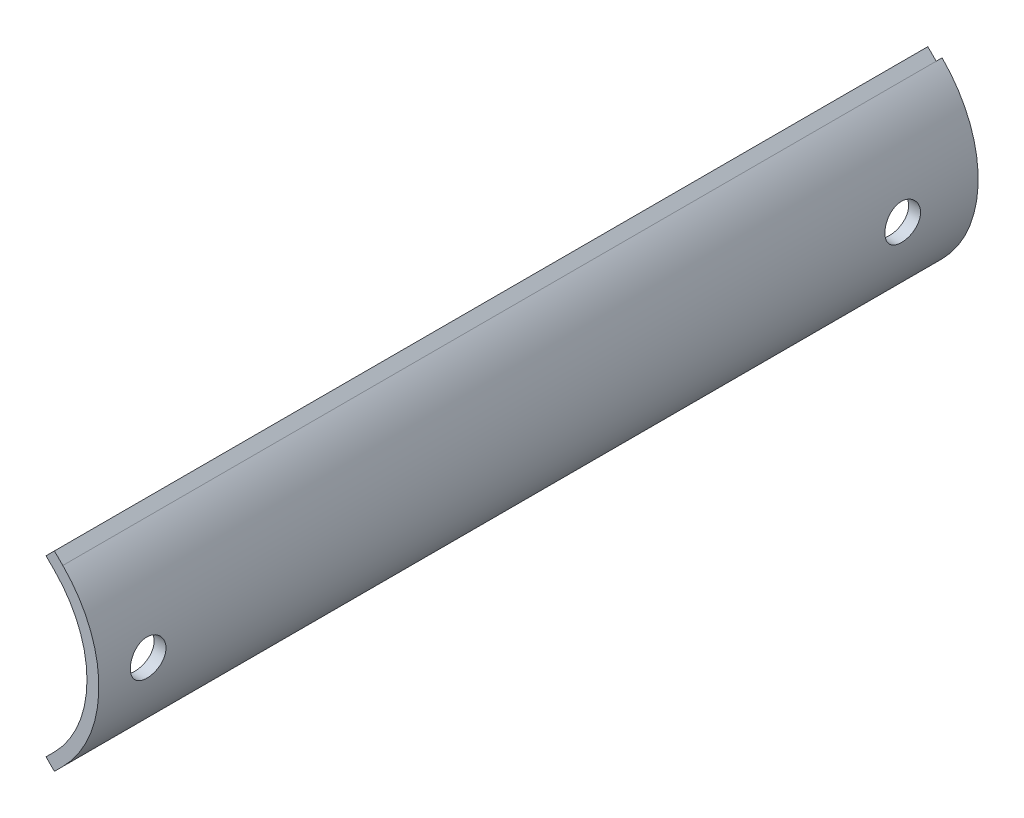
ISO-10303-21;
HEADER;
FILE_DESCRIPTION(('STEP AP214'),'2;1');
FILE_NAME('part.step','',(''),(''),'','','');
FILE_SCHEMA(('AUTOMOTIVE_DESIGN { 1 0 10303 214 1 1 1 1 }'));
ENDSEC;
DATA;
#1=APPLICATION_CONTEXT('core data for automotive mechanical design processes');
#2=APPLICATION_PROTOCOL_DEFINITION('international standard','automotive_design',2000,#1);
#3=PRODUCT_CONTEXT('',#1,'mechanical');
#4=PRODUCT('Part','Part','',(#3));
#5=PRODUCT_RELATED_PRODUCT_CATEGORY('part','',(#4));
#6=PRODUCT_DEFINITION_FORMATION('','',#4);
#7=PRODUCT_DEFINITION_CONTEXT('part definition',#1,'design');
#8=PRODUCT_DEFINITION('design','',#6,#7);
#9=PRODUCT_DEFINITION_SHAPE('','',#8);
#10=(LENGTH_UNIT() NAMED_UNIT(*) SI_UNIT(.MILLI.,.METRE.));
#11=(NAMED_UNIT(*) PLANE_ANGLE_UNIT() SI_UNIT($,.RADIAN.));
#12=(NAMED_UNIT(*) SI_UNIT($,.STERADIAN.) SOLID_ANGLE_UNIT());
#13=UNCERTAINTY_MEASURE_WITH_UNIT(LENGTH_MEASURE(1.E-05),#10,'distance_accuracy_value','');
#14=(GEOMETRIC_REPRESENTATION_CONTEXT(3) GLOBAL_UNCERTAINTY_ASSIGNED_CONTEXT((#13)) GLOBAL_UNIT_ASSIGNED_CONTEXT((#10,
#11,#12)) REPRESENTATION_CONTEXT('',''));
#15=CARTESIAN_POINT('',(0.,0.,0.));
#16=DIRECTION('',(0.,0.,1.));
#17=DIRECTION('',(1.,0.,0.));
#18=AXIS2_PLACEMENT_3D('',#15,#16,#17);
#19=CARTESIAN_POINT('',(0.,0.,0.));
#20=DIRECTION('',(0.,0.,-1.));
#21=DIRECTION('',(-1.,0.,0.));
#22=AXIS2_PLACEMENT_3D('',#19,#20,#21);
#23=PLANE('',#22);
#24=DIRECTION('',(-0.707106781186547,0.707106781186547,0.));
#25=VECTOR('',#24,1.);
#26=CARTESIAN_POINT('',(7.32562625309263,-7.32562625309263,0.));
#27=LINE('',#26,#25);
#28=CARTESIAN_POINT('',(7.32562625309263,-7.32562625309263,0.));
#29=VERTEX_POINT('',#28);
#30=CARTESIAN_POINT('',(6.61851947190609,-6.61851947190609,0.));
#31=VERTEX_POINT('',#30);
#32=EDGE_CURVE('E113',#29,#31,#27,.T.);
#33=ORIENTED_EDGE('',*,*,#32,.T.);
#34=CARTESIAN_POINT('',(0.,0.,0.));
#35=DIRECTION('',(0.,0.,-1.));
#36=DIRECTION('',(-1.,0.,0.));
#37=AXIS2_PLACEMENT_3D('',#34,#35,#36);
#38=CIRCLE('',#37,9.36);
#39=CARTESIAN_POINT('',(6.61851947190609,6.61851947190609,0.));
#40=VERTEX_POINT('',#39);
#41=EDGE_CURVE('E127',#40,#31,#38,.T.);
#42=ORIENTED_EDGE('',*,*,#41,.F.);
#43=DIRECTION('',(-0.707106781186547,-0.707106781186548,0.));
#44=VECTOR('',#43,1.);
#45=CARTESIAN_POINT('',(7.32562625309263,7.32562625309264,0.));
#46=LINE('',#45,#44);
#47=CARTESIAN_POINT('',(7.32562625309263,7.32562625309264,0.));
#48=VERTEX_POINT('',#47);
#49=EDGE_CURVE('E238',#48,#40,#46,.T.);
#50=ORIENTED_EDGE('',*,*,#49,.F.);
#51=CARTESIAN_POINT('',(0.,0.,0.));
#52=DIRECTION('',(0.,0.,1.));
#53=DIRECTION('',(-1.,0.,0.));
#54=AXIS2_PLACEMENT_3D('',#51,#52,#53);
#55=CIRCLE('',#54,10.36);
#56=EDGE_CURVE('E129',#29,#48,#55,.T.);
#57=ORIENTED_EDGE('',*,*,#56,.F.);
#58=EDGE_LOOP('',(#33,#42,#50,#57));
#59=FACE_BOUND('',#58,.T.);
#60=ADVANCED_FACE('F29',(#59),#23,.T.);
#61=CARTESIAN_POINT('',(0.,0.,74.));
#62=DIRECTION('',(0.,0.,-1.));
#63=DIRECTION('',(-1.,0.,0.));
#64=AXIS2_PLACEMENT_3D('',#61,#62,#63);
#65=CYLINDRICAL_SURFACE('',#64,9.36);
#66=CARTESIAN_POINT('',(9.36,0.,7.85));
#67=CARTESIAN_POINT('',(9.35999859929566,0.0836809453599104,7.84999660511019));
#68=CARTESIAN_POINT('',(9.35886608681882,0.167408707465155,7.84297384989874));
#69=CARTESIAN_POINT('',(9.35445730121113,0.33251909595575,7.81507824738174));
#70=CARTESIAN_POINT('',(9.35117901074674,0.413899440193147,7.79419236652518));
#71=CARTESIAN_POINT('',(9.34284665171027,0.571902026808532,7.73921467714927));
#72=CARTESIAN_POINT('',(9.33779399240882,0.648527988630463,7.70513334675773));
#73=CARTESIAN_POINT('',(9.32646954434616,0.794963136674017,7.62475892686162));
#74=CARTESIAN_POINT('',(9.32019790684035,0.864773167029071,7.57846735219579));
#75=CARTESIAN_POINT('',(9.30706942818151,0.996224417959779,7.47454952407655));
#76=CARTESIAN_POINT('',(9.30020833850995,1.05779642700246,7.41683624866749));
#77=CARTESIAN_POINT('',(9.28670705070545,1.17042625498666,7.29190058813634));
#78=CARTESIAN_POINT('',(9.28006686603295,1.22148343420617,7.22467762486454));
#79=CARTESIAN_POINT('',(9.26771804977288,1.31190853528462,7.08215943791931));
#80=CARTESIAN_POINT('',(9.26201490878808,1.35120859583976,7.00682064036447));
#81=CARTESIAN_POINT('',(9.25224450093774,1.41657002943423,6.85050450047566));
#82=CARTESIAN_POINT('',(9.24817713210243,1.44263222771401,6.76952750998122));
#83=CARTESIAN_POINT('',(9.24218088717903,1.48056127958953,6.60496507140055));
#84=CARTESIAN_POINT('',(9.24023407851776,1.49254723793794,6.52140774068969));
#85=CARTESIAN_POINT('',(9.2386450586927,1.50235273554082,6.35344691030452));
#86=CARTESIAN_POINT('',(9.23900269668833,1.50017320201608,6.26904346637474));
#87=CARTESIAN_POINT('',(9.24196577839861,1.48180672579417,6.10263301690115));
#88=CARTESIAN_POINT('',(9.24454982374173,1.46575312458955,6.02061085840732));
#89=CARTESIAN_POINT('',(9.25164109554355,1.4203032658374,5.86043950253038));
#90=CARTESIAN_POINT('',(9.25614838340321,1.39090658230006,5.78229042888732));
#91=CARTESIAN_POINT('',(9.26660160523718,1.31946845169473,5.63168184337337));
#92=CARTESIAN_POINT('',(9.27255386576054,1.27737119510494,5.55924926074816));
#93=CARTESIAN_POINT('',(9.28522190134457,1.18176657685072,5.42242556085728));
#94=CARTESIAN_POINT('',(9.29193773345603,1.12825836234666,5.35803504521557));
#95=CARTESIAN_POINT('',(9.30547044000936,1.01062206815413,5.23835106418754));
#96=CARTESIAN_POINT('',(9.31228759138349,0.946379488080598,5.18317010950779));
#97=CARTESIAN_POINT('',(9.3251836589994,0.809486507273299,5.08435489445191));
#98=CARTESIAN_POINT('',(9.33126257112609,0.736836059676898,5.040720698438));
#99=CARTESIAN_POINT('',(9.34200492847548,0.585087115514167,4.9662291494726));
#100=CARTESIAN_POINT('',(9.34666732726415,0.50598390649525,4.93538123615164));
#101=CARTESIAN_POINT('',(9.35404280264126,0.343628145732335,4.88743970078878));
#102=CARTESIAN_POINT('',(9.35675602985646,0.260375915145399,4.87034501592205));
#103=CARTESIAN_POINT('',(9.35990732192218,0.093055591032676,4.85054655847075));
#104=CARTESIAN_POINT('',(9.36036981828607,0.0090062277521951,4.84768824314363));
#105=CARTESIAN_POINT('',(9.35903429083987,-0.158370879756632,4.85603236388217));
#106=CARTESIAN_POINT('',(9.35723634723477,-0.241698649482949,4.86723430106161));
#107=CARTESIAN_POINT('',(9.35159707551196,-0.404793510862415,4.90325241283125));
#108=CARTESIAN_POINT('',(9.34776716221174,-0.484577821394899,4.92799255916173));
#109=CARTESIAN_POINT('',(9.33849178517076,-0.638866237418552,4.9903041053227));
#110=CARTESIAN_POINT('',(9.33304623647635,-0.713370064995051,5.02787617989985));
#111=CARTESIAN_POINT('',(9.32108343769909,-0.855657197304529,5.1151424125202));
#112=CARTESIAN_POINT('',(9.31455774399256,-0.923380207556733,5.16493370100128));
#113=CARTESIAN_POINT('',(9.30118531473672,-1.04956438750733,5.27509071839483));
#114=CARTESIAN_POINT('',(9.29433855775267,-1.10802493768345,5.33545715406088));
#115=CARTESIAN_POINT('',(9.28101727757596,-1.21459341219139,5.46574200745803));
#116=CARTESIAN_POINT('',(9.27454692915053,-1.26259723996736,5.53574606578112));
#117=CARTESIAN_POINT('',(9.26278742374638,-1.34616397865572,5.6829150451557));
#118=CARTESIAN_POINT('',(9.25749823143532,-1.3817272617245,5.76007975191045));
#119=CARTESIAN_POINT('',(9.24873079721998,-1.43924546157381,5.91908088296987));
#120=CARTESIAN_POINT('',(9.24524551247209,-1.46125336645734,6.00089773324973));
#121=CARTESIAN_POINT('',(9.24046242008603,-1.49120361871297,6.16712693751239));
#122=CARTESIAN_POINT('',(9.23916443793908,-1.49914708818555,6.25153908388837));
#123=CARTESIAN_POINT('',(9.23891004057968,-1.5007135062992,6.41952404275549));
#124=CARTESIAN_POINT('',(9.23992684587668,-1.49450023185646,6.50309533304435));
#125=CARTESIAN_POINT('',(9.24412895913257,-1.46828241478565,6.66798745029542));
#126=CARTESIAN_POINT('',(9.24731426154434,-1.4482779074361,6.74930828301382));
#127=CARTESIAN_POINT('',(9.2554846102504,-1.39510633005045,6.90733484965043));
#128=CARTESIAN_POINT('',(9.26046787133224,-1.361952313073,6.98404507366245));
#129=CARTESIAN_POINT('',(9.2716745447873,-1.28343943058366,7.13084097216506));
#130=CARTESIAN_POINT('',(9.27789801100035,-1.23808003518138,7.2009263588631));
#131=CARTESIAN_POINT('',(9.29096924875413,-1.13585527222732,7.33331244509848));
#132=CARTESIAN_POINT('',(9.29782312278103,-1.07886908253516,7.39551925906767));
#133=CARTESIAN_POINT('',(9.3113333492132,-0.955263508312622,7.50954414204538));
#134=CARTESIAN_POINT('',(9.31798965555555,-0.888641898218734,7.56135980431653));
#135=CARTESIAN_POINT('',(9.3304034109689,-0.747156433472853,7.65342927732856));
#136=CARTESIAN_POINT('',(9.33615489434667,-0.672243005521155,7.69360771082528));
#137=CARTESIAN_POINT('',(9.34605279420502,-0.516670756457445,7.76074958062144));
#138=CARTESIAN_POINT('',(9.35020083376507,-0.436017843586017,7.78772638761187));
#139=CARTESIAN_POINT('',(9.35550267794877,-0.295859871024031,7.82173843499651));
#140=CARTESIAN_POINT('',(9.35718030013375,-0.237209805969826,7.83231985950944));
#141=CARTESIAN_POINT('',(9.35942945101886,-0.11904771770281,7.84645179619545));
#142=CARTESIAN_POINT('',(9.36000099654615,-0.0595357076169722,7.85000241533083));
#143=CARTESIAN_POINT('',(9.36,0.,7.85));
#144=B_SPLINE_CURVE_WITH_KNOTS('',3,(#66,#67,#68,#69,#70,#71,#72,#73,#74,#75,#76,#77,#78,#79,
#80,#81,#82,#83,#84,#85,#86,#87,#88,#89,#90,#91,#92,#93,#94,#95,#96,#97,#98,#99,#100,#101,#102,
#103,#104,#105,#106,#107,#108,#109,#110,#111,#112,#113,#114,#115,#116,#117,#118,#119,#120,#121,
#122,#123,#124,#125,#126,#127,#128,#129,#130,#131,#132,#133,#134,#135,#136,#137,#138,#139,#140,
#141,#142,#143),.UNSPECIFIED.,.T.,.F.,(4,2,2,2,2,2,2,2,2,2,2,2,2,2,2,2,2,2,2,2,2,2,2,2,2,2,2,2,
2,2,2,2,2,2,2,2,2,2,4),(0.,0.250825244063169,0.501886638542506,0.752749079902014,
1.00358041315788,1.25640199821518,1.50923896039077,1.76350830830882,2.01776180328105,
2.26984809181353,2.52191787987497,2.77159166999001,3.02127343172406,3.27206874636038,
3.52288281167451,3.77656650863536,4.0302516196122,4.28412368459231,4.53797612890956,
4.78906678194697,5.04014852603156,5.28983449671695,5.53953359876652,5.79128578300822,
6.04305479866414,6.29722595235506,6.5513895019169,6.80455311143401,7.05769652193128,
7.30792625046594,7.55815533890563,7.80813665287639,8.05812882141256,8.31086483627985,
8.56365932093848,8.81805636423177,9.07219521657587,9.250650246174,9.429102560847),.UNSPECIFIED.);
#145=CARTESIAN_POINT('',(9.36,0.,7.85));
#146=VERTEX_POINT('',#145);
#147=EDGE_CURVE('E142',#146,#146,#144,.T.);
#148=ORIENTED_EDGE('',*,*,#147,.F.);
#149=EDGE_LOOP('',(#148));
#150=FACE_BOUND('',#149,.T.);
#151=ORIENTED_EDGE('',*,*,#41,.T.);
#152=DIRECTION('',(0.,0.,-1.));
#153=VECTOR('',#152,1.);
#154=CARTESIAN_POINT('',(6.61851947190609,-6.61851947190609,0.));
#155=LINE('',#154,#153);
#156=CARTESIAN_POINT('',(6.61851947190609,-6.61851947190609,0.498210358983897));
#157=VERTEX_POINT('',#156);
#158=EDGE_CURVE('E109',#157,#31,#155,.T.);
#159=ORIENTED_EDGE('',*,*,#158,.F.);
#160=DIRECTION('',(0.,0.,-1.));
#161=VECTOR('',#160,1.);
#162=CARTESIAN_POINT('',(6.61851947190608,-6.61851947190608,74.));
#163=LINE('',#162,#161);
#164=CARTESIAN_POINT('',(6.61851947190608,-6.61851947190608,74.));
#165=VERTEX_POINT('',#164);
#166=EDGE_CURVE('E41',#165,#157,#163,.T.);
#167=ORIENTED_EDGE('',*,*,#166,.F.);
#168=CARTESIAN_POINT('',(0.,0.,74.));
#169=DIRECTION('',(0.,0.,-1.));
#170=DIRECTION('',(-1.,0.,0.));
#171=AXIS2_PLACEMENT_3D('',#168,#169,#170);
#172=CIRCLE('',#171,9.36);
#173=CARTESIAN_POINT('',(6.61851947190608,6.61851947190608,74.));
#174=VERTEX_POINT('',#173);
#175=EDGE_CURVE('E139',#174,#165,#172,.T.);
#176=ORIENTED_EDGE('',*,*,#175,.F.);
#177=DIRECTION('',(0.,0.,-1.));
#178=VECTOR('',#177,1.);
#179=CARTESIAN_POINT('',(6.61851947190608,6.61851947190608,74.));
#180=LINE('',#179,#178);
#181=CARTESIAN_POINT('',(6.61851947190609,6.61851947190609,0.495242112450001));
#182=VERTEX_POINT('',#181);
#183=EDGE_CURVE('E152',#174,#182,#180,.T.);
#184=ORIENTED_EDGE('',*,*,#183,.T.);
#185=DIRECTION('',(0.,0.,1.));
#186=VECTOR('',#185,1.);
#187=CARTESIAN_POINT('',(6.61851947190609,6.61851947190609,0.));
#188=LINE('',#187,#186);
#189=EDGE_CURVE('E136',#40,#182,#188,.T.);
#190=ORIENTED_EDGE('',*,*,#189,.F.);
#191=EDGE_LOOP('',(#151,#159,#167,#176,#184,#190));
#192=FACE_BOUND('',#191,.T.);
#193=CARTESIAN_POINT('',(9.36,0.,71.35));
#194=CARTESIAN_POINT('',(9.35999859929566,0.0836809453599102,71.3499966051102));
#195=CARTESIAN_POINT('',(9.35886608681882,0.167408707465155,71.3429738498987));
#196=CARTESIAN_POINT('',(9.35445730121113,0.33251909595575,71.3150782473817));
#197=CARTESIAN_POINT('',(9.35117901074674,0.413899440193146,71.2941923665252));
#198=CARTESIAN_POINT('',(9.34284665171027,0.571902026808533,71.2392146771493));
#199=CARTESIAN_POINT('',(9.33779399240882,0.648527988630466,71.2051333467577));
#200=CARTESIAN_POINT('',(9.32646954434616,0.794963136674021,71.1247589268616));
#201=CARTESIAN_POINT('',(9.32019790684035,0.864773167029073,71.0784673521958));
#202=CARTESIAN_POINT('',(9.30706942818151,0.996224417959779,70.9745495240766));
#203=CARTESIAN_POINT('',(9.30020833850995,1.05779642700246,70.9168362486675));
#204=CARTESIAN_POINT('',(9.28670705070545,1.17042625498666,70.7919005881363));
#205=CARTESIAN_POINT('',(9.28006686603295,1.22148343420617,70.7246776248645));
#206=CARTESIAN_POINT('',(9.26771804977288,1.31190853528462,70.5821594379193));
#207=CARTESIAN_POINT('',(9.26201490878808,1.35120859583975,70.5068206403645));
#208=CARTESIAN_POINT('',(9.25224450093774,1.41657002943422,70.3505045004757));
#209=CARTESIAN_POINT('',(9.24817713210243,1.44263222771401,70.2695275099812));
#210=CARTESIAN_POINT('',(9.24218088717903,1.48056127958953,70.1049650714005));
#211=CARTESIAN_POINT('',(9.24023407851776,1.49254723793793,70.0214077406897));
#212=CARTESIAN_POINT('',(9.2386450586927,1.50235273554082,69.8534469103045));
#213=CARTESIAN_POINT('',(9.23900269668833,1.50017320201608,69.7690434663747));
#214=CARTESIAN_POINT('',(9.24196577839861,1.48180672579416,69.6026330169011));
#215=CARTESIAN_POINT('',(9.24454982374173,1.46575312458955,69.5206108584073));
#216=CARTESIAN_POINT('',(9.25164109554355,1.42030326583739,69.3604395025304));
#217=CARTESIAN_POINT('',(9.25614838340321,1.39090658230005,69.2822904288873));
#218=CARTESIAN_POINT('',(9.26660160523718,1.31946845169473,69.1316818433734));
#219=CARTESIAN_POINT('',(9.27255386576055,1.27737119510493,69.0592492607481));
#220=CARTESIAN_POINT('',(9.28522190134458,1.18176657685071,68.9224255608573));
#221=CARTESIAN_POINT('',(9.29193773345603,1.12825836234664,68.8580350452156));
#222=CARTESIAN_POINT('',(9.30547044000936,1.01062206815412,68.7383510641875));
#223=CARTESIAN_POINT('',(9.31228759138349,0.946379488080593,68.6831701095078));
#224=CARTESIAN_POINT('',(9.3251836589994,0.8094865072733,68.5843548944519));
#225=CARTESIAN_POINT('',(9.33126257112609,0.736836059676901,68.540720698438));
#226=CARTESIAN_POINT('',(9.34200492847548,0.585087115514172,68.4662291494726));
#227=CARTESIAN_POINT('',(9.34666732726415,0.505983906495255,68.4353812361516));
#228=CARTESIAN_POINT('',(9.35404280264126,0.34362814573234,68.3874397007888));
#229=CARTESIAN_POINT('',(9.35675602985646,0.260375915145403,68.370345015922));
#230=CARTESIAN_POINT('',(9.35990732192218,0.0930555910326775,68.3505465584708));
#231=CARTESIAN_POINT('',(9.36036981828607,0.00900622775219582,68.3476882431436));
#232=CARTESIAN_POINT('',(9.35903429083987,-0.158370879756634,68.3560323638822));
#233=CARTESIAN_POINT('',(9.35723634723477,-0.241698649482952,68.3672343010616));
#234=CARTESIAN_POINT('',(9.35159707551196,-0.404793510862418,68.4032524128312));
#235=CARTESIAN_POINT('',(9.34776716221174,-0.484577821394899,68.4279925591617));
#236=CARTESIAN_POINT('',(9.33849178517076,-0.638866237418552,68.4903041053227));
#237=CARTESIAN_POINT('',(9.33304623647635,-0.713370064995053,68.5278761798998));
#238=CARTESIAN_POINT('',(9.32108343769909,-0.855657197304532,68.6151424125202));
#239=CARTESIAN_POINT('',(9.31455774399256,-0.923380207556735,68.6649337010013));
#240=CARTESIAN_POINT('',(9.30118531473672,-1.04956438750733,68.7750907183948));
#241=CARTESIAN_POINT('',(9.29433855775267,-1.10802493768345,68.8354571540609));
#242=CARTESIAN_POINT('',(9.28101727757596,-1.21459341219139,68.965742007458));
#243=CARTESIAN_POINT('',(9.27454692915053,-1.26259723996736,69.0357460657811));
#244=CARTESIAN_POINT('',(9.26278742374638,-1.34616397865573,69.1829150451557));
#245=CARTESIAN_POINT('',(9.25749823143532,-1.3817272617245,69.2600797519105));
#246=CARTESIAN_POINT('',(9.24873079721998,-1.43924546157381,69.4190808829699));
#247=CARTESIAN_POINT('',(9.24524551247209,-1.46125336645734,69.5008977332497));
#248=CARTESIAN_POINT('',(9.24046242008603,-1.49120361871297,69.6671269375124));
#249=CARTESIAN_POINT('',(9.23916443793908,-1.49914708818555,69.7515390838884));
#250=CARTESIAN_POINT('',(9.23891004057968,-1.5007135062992,69.9195240427555));
#251=CARTESIAN_POINT('',(9.23992684587668,-1.49450023185645,70.0030953330444));
#252=CARTESIAN_POINT('',(9.24412895913257,-1.46828241478564,70.1679874502954));
#253=CARTESIAN_POINT('',(9.24731426154434,-1.44827790743609,70.2493082830138));
#254=CARTESIAN_POINT('',(9.2554846102504,-1.39510633005045,70.4073348496504));
#255=CARTESIAN_POINT('',(9.26046787133224,-1.36195231307299,70.4840450736625));
#256=CARTESIAN_POINT('',(9.2716745447873,-1.28343943058366,70.6308409721651));
#257=CARTESIAN_POINT('',(9.27789801100035,-1.23808003518137,70.7009263588631));
#258=CARTESIAN_POINT('',(9.29096924875413,-1.13585527222732,70.8333124450985));
#259=CARTESIAN_POINT('',(9.29782312278103,-1.07886908253516,70.8955192590677));
#260=CARTESIAN_POINT('',(9.3113333492132,-0.955263508312619,71.0095441420454));
#261=CARTESIAN_POINT('',(9.31798965555555,-0.888641898218732,71.0613598043165));
#262=CARTESIAN_POINT('',(9.3304034109689,-0.747156433472849,71.1534292773286));
#263=CARTESIAN_POINT('',(9.33615489434667,-0.672243005521147,71.1936077108253));
#264=CARTESIAN_POINT('',(9.34605279420502,-0.516670756457435,71.2607495806214));
#265=CARTESIAN_POINT('',(9.35020083376507,-0.436017843586009,71.2877263876119));
#266=CARTESIAN_POINT('',(9.35550267794877,-0.295859871024026,71.3217384349965));
#267=CARTESIAN_POINT('',(9.35718030013375,-0.237209805969822,71.3323198595094));
#268=CARTESIAN_POINT('',(9.35942945101886,-0.119047717702809,71.3464517961954));
#269=CARTESIAN_POINT('',(9.36000099654615,-0.0595357076169719,71.3500024153308));
#270=CARTESIAN_POINT('',(9.36,0.,71.35));
#271=B_SPLINE_CURVE_WITH_KNOTS('',3,(#193,#194,#195,#196,#197,#198,#199,#200,#201,#202,#203,
#204,#205,#206,#207,#208,#209,#210,#211,#212,#213,#214,#215,#216,#217,#218,#219,#220,#221,#222,
#223,#224,#225,#226,#227,#228,#229,#230,#231,#232,#233,#234,#235,#236,#237,#238,#239,#240,#241,
#242,#243,#244,#245,#246,#247,#248,#249,#250,#251,#252,#253,#254,#255,#256,#257,#258,#259,#260,
#261,#262,#263,#264,#265,#266,#267,#268,#269,#270),.UNSPECIFIED.,.T.,.F.,(4,2,2,2,2,2,2,2,2,2,2,
2,2,2,2,2,2,2,2,2,2,2,2,2,2,2,2,2,2,2,2,2,2,2,2,2,2,2,4),(0.,0.250825244063168,
0.501886638542509,0.752749079902017,1.00358041315788,1.25640199821517,1.50923896039077,
1.76350830830882,2.01776180328106,2.26984809181353,2.52191787987498,2.77159166999002,
3.02127343172407,3.2720687463604,3.52288281167452,3.77656650863536,4.03025161961219,
4.28412368459231,4.53797612890956,4.78906678194697,5.04014852603156,5.28983449671694,
5.53953359876652,5.79128578300822,6.04305479866415,6.29722595235508,6.5513895019169,
6.80455311143401,7.05769652193128,7.30792625046595,7.55815533890565,7.80813665287639,
8.05812882141255,8.31086483627984,8.56365932093848,8.81805636423177,9.07219521657587,
9.25065024617399,9.42910256084699),.UNSPECIFIED.);
#272=CARTESIAN_POINT('',(9.36,0.,71.35));
#273=VERTEX_POINT('',#272);
#274=EDGE_CURVE('E163',#273,#273,#271,.T.);
#275=ORIENTED_EDGE('',*,*,#274,.F.);
#276=EDGE_LOOP('',(#275));
#277=FACE_BOUND('',#276,.T.);
#278=ADVANCED_FACE('F31',(#150,#192,#277),#65,.F.);
#279=CARTESIAN_POINT('',(0.,0.,74.));
#280=DIRECTION('',(0.,0.,-1.));
#281=DIRECTION('',(-1.,0.,0.));
#282=AXIS2_PLACEMENT_3D('',#279,#280,#281);
#283=CYLINDRICAL_SURFACE('',#282,10.36);
#284=CARTESIAN_POINT('',(10.36,0.,7.85));
#285=CARTESIAN_POINT('',(10.3599986903093,-0.0837856952991977,7.84999651948698));
#286=CARTESIAN_POINT('',(10.3589729139512,-0.167620844794245,7.84295626399375));
#287=CARTESIAN_POINT('',(10.3549795988644,-0.332950162396493,7.81498705651188));
#288=CARTESIAN_POINT('',(10.3520101389322,-0.414441930940885,7.7940443625857));
#289=CARTESIAN_POINT('',(10.3444633415673,-0.572667724523088,7.73890719632244));
#290=CARTESIAN_POINT('',(10.3398871901645,-0.649405210060941,7.70472249707222));
#291=CARTESIAN_POINT('',(10.32963340619,-0.796042234432184,7.62409504792337));
#292=CARTESIAN_POINT('',(10.3239559345924,-0.865942770343077,7.57765408910024));
#293=CARTESIAN_POINT('',(10.3120850889928,-0.997444239779235,7.47347099101193));
#294=CARTESIAN_POINT('',(10.3058885905274,-1.05898804396582,7.4156570906849));
#295=CARTESIAN_POINT('',(10.2937026922144,-1.1715363318041,7.29052361133283));
#296=CARTESIAN_POINT('',(10.2877133039763,-1.22254022543582,7.22320350050882));
#297=CARTESIAN_POINT('',(10.2765893862608,-1.31278124890228,7.08058737224275));
#298=CARTESIAN_POINT('',(10.2714588932846,-1.35196347608878,7.00525627278009));
#299=CARTESIAN_POINT('',(10.2626760496169,-1.41709812592031,6.84899579863835));
#300=CARTESIAN_POINT('',(10.2590236239029,-1.44305122005583,6.76806670834155));
#301=CARTESIAN_POINT('',(10.253641014607,-1.48081426816811,6.60350678550743));
#302=CARTESIAN_POINT('',(10.2518975805757,-1.49272175890871,6.51989877685555));
#303=CARTESIAN_POINT('',(10.2504900659656,-1.50235767378017,6.35185451121139));
#304=CARTESIAN_POINT('',(10.2508258740287,-1.50008685725872,6.26741829881704));
#305=CARTESIAN_POINT('',(10.2535267813576,-1.48151040487662,6.10080138848088));
#306=CARTESIAN_POINT('',(10.2558762119055,-1.46531313265999,6.01860831838849));
#307=CARTESIAN_POINT('',(10.2623151767654,-1.41951305776901,5.85811903476502));
#308=CARTESIAN_POINT('',(10.2664047572163,-1.38990989964455,5.77982292462089));
#309=CARTESIAN_POINT('',(10.2758806422657,-1.31802483644425,5.62901885059282));
#310=CARTESIAN_POINT('',(10.2812716540278,-1.27569676693746,5.55653320018541));
#311=CARTESIAN_POINT('',(10.2927395207755,-1.17959632824583,5.41965247777881));
#312=CARTESIAN_POINT('',(10.298816417731,-1.12582325855263,5.35525790138975));
#313=CARTESIAN_POINT('',(10.3110406717919,-1.00776313479754,5.23575900288351));
#314=CARTESIAN_POINT('',(10.3171881581731,-0.943382859359441,5.18074675122031));
#315=CARTESIAN_POINT('',(10.3288083025884,-0.806254287286743,5.0822941077441));
#316=CARTESIAN_POINT('',(10.3342809580207,-0.733505958390658,5.03885376054659));
#317=CARTESIAN_POINT('',(10.3439399847382,-0.581628497353418,4.96477435028858));
#318=CARTESIAN_POINT('',(10.3481256719771,-0.502496000023917,4.93414209185097));
#319=CARTESIAN_POINT('',(10.3547333409056,-0.34013600415533,4.88662688135312));
#320=CARTESIAN_POINT('',(10.357155433614,-0.256908763733705,4.86974306381656));
#321=CARTESIAN_POINT('',(10.3599483683378,-0.0895167515421641,4.85032574124423));
#322=CARTESIAN_POINT('',(10.3603373108562,-0.00536695989614712,4.8476656023432));
#323=CARTESIAN_POINT('',(10.3590693040557,0.162177437758859,4.85643545509347));
#324=CARTESIAN_POINT('',(10.3574124136276,0.245572065436147,4.86786504116245));
#325=CARTESIAN_POINT('',(10.3522501145987,0.408857502901127,4.90438461521666));
#326=CARTESIAN_POINT('',(10.3487530171824,0.488762330952589,4.92941320055048));
#327=CARTESIAN_POINT('',(10.3403012805124,0.643241321386849,4.9923557559325));
#328=CARTESIAN_POINT('',(10.335346576899,0.717815248205467,5.03027029496536));
#329=CARTESIAN_POINT('',(10.3244855797924,0.86007435019489,5.11820766160475));
#330=CARTESIAN_POINT('',(10.3185730369212,0.927709164972578,5.1683111729977));
#331=CARTESIAN_POINT('',(10.3064747141903,1.05365533161075,5.27909149686176));
#332=CARTESIAN_POINT('',(10.300288919603,1.11196618015241,5.33976887975385));
#333=CARTESIAN_POINT('',(10.2882842154251,1.2180674149289,5.47053700355247));
#334=CARTESIAN_POINT('',(10.2824685064342,1.26577311823606,5.54069679168205));
#335=CARTESIAN_POINT('',(10.2719182511086,1.34872205838641,5.68810812558818));
#336=CARTESIAN_POINT('',(10.2671836771589,1.38396561355885,5.7653594901562));
#337=CARTESIAN_POINT('',(10.2593546504635,1.44085725790065,5.92450397038218));
#338=CARTESIAN_POINT('',(10.2562547418439,1.46255061764221,6.00638062237436));
#339=CARTESIAN_POINT('',(10.252031277542,1.49187057151423,6.17266310576478));
#340=CARTESIAN_POINT('',(10.2509075954746,1.49949806519676,6.25706877507431));
#341=CARTESIAN_POINT('',(10.2507683085672,1.50044945760964,6.4251696572035));
#342=CARTESIAN_POINT('',(10.2517330844704,1.4939064754288,6.50886413093732));
#343=CARTESIAN_POINT('',(10.25561947207,1.46698716242888,6.67394935820302));
#344=CARTESIAN_POINT('',(10.2585410814613,1.44661084790516,6.75534011444852));
#345=CARTESIAN_POINT('',(10.2660052611236,1.39264916816506,6.91347491604102));
#346=CARTESIAN_POINT('',(10.2705467675806,1.35907247038971,6.9902219723875));
#347=CARTESIAN_POINT('',(10.2807404150379,1.2796763139639,7.13701481704771));
#348=CARTESIAN_POINT('',(10.2863925884385,1.23385649814523,7.20706040977882));
#349=CARTESIAN_POINT('',(10.2982340298013,1.13078873262522,7.33913933364771));
#350=CARTESIAN_POINT('',(10.3044276580197,1.07344202506495,7.40109521636569));
#351=CARTESIAN_POINT('',(10.3166172663495,0.949156853454672,7.51455226837602));
#352=CARTESIAN_POINT('',(10.3226132000586,0.882216156968174,7.56605099762171));
#353=CARTESIAN_POINT('',(10.333766647996,0.740242366910434,7.65736504902196));
#354=CARTESIAN_POINT('',(10.3389197200863,0.665169658876675,7.69711930729061));
#355=CARTESIAN_POINT('',(10.3477630623503,0.509375151935641,7.76339595456849));
#356=CARTESIAN_POINT('',(10.3514548634439,0.428659369977305,7.7899321991798));
#357=CARTESIAN_POINT('',(10.3561063544628,0.289640459844892,7.82292479225512));
#358=CARTESIAN_POINT('',(10.3575590596909,0.23219990984657,7.83306268828275));
#359=CARTESIAN_POINT('',(10.3595063325154,0.116514206828547,7.84660146474419));
#360=CARTESIAN_POINT('',(10.3600009108291,0.0582690628161208,7.85000242053528));
#361=CARTESIAN_POINT('',(10.36,0.,7.85));
#362=B_SPLINE_CURVE_WITH_KNOTS('',3,(#284,#285,#286,#287,#288,#289,#290,#291,#292,#293,#294,
#295,#296,#297,#298,#299,#300,#301,#302,#303,#304,#305,#306,#307,#308,#309,#310,#311,#312,#313,
#314,#315,#316,#317,#318,#319,#320,#321,#322,#323,#324,#325,#326,#327,#328,#329,#330,#331,#332,
#333,#334,#335,#336,#337,#338,#339,#340,#341,#342,#343,#344,#345,#346,#347,#348,#349,#350,#351,
#352,#353,#354,#355,#356,#357,#358,#359,#360,#361),.UNSPECIFIED.,.T.,.F.,(4,2,2,2,2,2,2,2,2,2,2,
2,2,2,2,2,2,2,2,2,2,2,2,2,2,2,2,2,2,2,2,2,2,2,2,2,2,2,4),(0.,0.251144183491259,
0.502536982133371,0.753744596061633,1.00491551992946,1.25772528974362,1.51054920791622,
1.76452984016499,2.0184975794629,2.27069111107065,2.52287113606411,2.77310649100634,
3.02334848119757,3.27450950514203,3.52568590619577,3.77920068090379,4.03271643302401,
4.28636670122337,4.54000100068272,4.79137337933834,5.04273852223806,5.2929780122114,
5.54322855304946,5.79518296911462,6.04715098139202,6.30106396004256,6.55497045235041,
6.80802405277979,7.06106146915185,7.31173214066016,7.56240251688432,7.81290857577923,
8.06342194347986,8.31618086199309,8.5689986910529,8.82310876989267,9.07695191780191,
9.2516129962219,9.42627212092687),.UNSPECIFIED.);
#363=CARTESIAN_POINT('',(10.36,0.,7.85));
#364=VERTEX_POINT('',#363);
#365=EDGE_CURVE('E137',#364,#364,#362,.T.);
#366=ORIENTED_EDGE('',*,*,#365,.F.);
#367=EDGE_LOOP('',(#366));
#368=FACE_BOUND('',#367,.T.);
#369=ORIENTED_EDGE('',*,*,#56,.T.);
#370=DIRECTION('',(0.,0.,-1.));
#371=VECTOR('',#370,1.);
#372=CARTESIAN_POINT('',(7.32562625309263,7.32562625309264,0.));
#373=LINE('',#372,#371);
#374=CARTESIAN_POINT('',(7.32562625309263,7.32562625309264,0.495242112450001));
#375=VERTEX_POINT('',#374);
#376=EDGE_CURVE('E230',#375,#48,#373,.T.);
#377=ORIENTED_EDGE('',*,*,#376,.F.);
#378=DIRECTION('',(0.,0.,-1.));
#379=VECTOR('',#378,1.);
#380=CARTESIAN_POINT('',(7.32562625309263,7.32562625309263,74.));
#381=LINE('',#380,#379);
#382=CARTESIAN_POINT('',(7.32562625309263,7.32562625309263,74.));
#383=VERTEX_POINT('',#382);
#384=EDGE_CURVE('E154',#383,#375,#381,.T.);
#385=ORIENTED_EDGE('',*,*,#384,.F.);
#386=CARTESIAN_POINT('',(0.,0.,74.));
#387=DIRECTION('',(0.,0.,1.));
#388=DIRECTION('',(-1.,0.,0.));
#389=AXIS2_PLACEMENT_3D('',#386,#387,#388);
#390=CIRCLE('',#389,10.36);
#391=CARTESIAN_POINT('',(7.32562625309263,-7.32562625309263,74.));
#392=VERTEX_POINT('',#391);
#393=EDGE_CURVE('E150',#392,#383,#390,.T.);
#394=ORIENTED_EDGE('',*,*,#393,.F.);
#395=DIRECTION('',(0.,0.,-1.));
#396=VECTOR('',#395,1.);
#397=CARTESIAN_POINT('',(7.32562625309263,-7.32562625309263,74.));
#398=LINE('',#397,#396);
#399=CARTESIAN_POINT('',(7.32562625309263,-7.32562625309263,0.498210358983897));
#400=VERTEX_POINT('',#399);
#401=EDGE_CURVE('E157',#392,#400,#398,.T.);
#402=ORIENTED_EDGE('',*,*,#401,.T.);
#403=DIRECTION('',(0.,0.,-1.));
#404=VECTOR('',#403,1.);
#405=CARTESIAN_POINT('',(7.32562625309263,-7.32562625309263,0.));
#406=LINE('',#405,#404);
#407=EDGE_CURVE('E245',#400,#29,#406,.T.);
#408=ORIENTED_EDGE('',*,*,#407,.T.);
#409=EDGE_LOOP('',(#369,#377,#385,#394,#402,#408));
#410=FACE_BOUND('',#409,.T.);
#411=CARTESIAN_POINT('',(10.36,0.,71.35));
#412=CARTESIAN_POINT('',(10.3599986903093,-0.083785695299197,71.349996519487));
#413=CARTESIAN_POINT('',(10.3589729139512,-0.167620844794243,71.3429562639937));
#414=CARTESIAN_POINT('',(10.3549795988644,-0.332950162396492,71.3149870565119));
#415=CARTESIAN_POINT('',(10.3520101389322,-0.414441930940885,71.2940443625857));
#416=CARTESIAN_POINT('',(10.3444633415673,-0.572667724523089,71.2389071963224));
#417=CARTESIAN_POINT('',(10.3398871901645,-0.649405210060942,71.2047224970722));
#418=CARTESIAN_POINT('',(10.32963340619,-0.796042234432184,71.1240950479234));
#419=CARTESIAN_POINT('',(10.3239559345924,-0.865942770343076,71.0776540891002));
#420=CARTESIAN_POINT('',(10.3120850889928,-0.997444239779236,70.9734709910119));
#421=CARTESIAN_POINT('',(10.3058885905274,-1.05898804396582,70.9156570906849));
#422=CARTESIAN_POINT('',(10.2937026922144,-1.1715363318041,70.7905236113328));
#423=CARTESIAN_POINT('',(10.2877133039763,-1.22254022543582,70.7232035005088));
#424=CARTESIAN_POINT('',(10.2765893862608,-1.31278124890229,70.5805873722427));
#425=CARTESIAN_POINT('',(10.2714588932846,-1.35196347608878,70.5052562727801));
#426=CARTESIAN_POINT('',(10.2626760496169,-1.41709812592031,70.3489957986383));
#427=CARTESIAN_POINT('',(10.2590236239029,-1.44305122005583,70.2680667083415));
#428=CARTESIAN_POINT('',(10.253641014607,-1.48081426816811,70.1035067855074));
#429=CARTESIAN_POINT('',(10.2518975805757,-1.4927217589087,70.0198987768555));
#430=CARTESIAN_POINT('',(10.2504900659656,-1.50235767378017,69.8518545112114));
#431=CARTESIAN_POINT('',(10.2508258740287,-1.50008685725872,69.767418298817));
#432=CARTESIAN_POINT('',(10.2535267813576,-1.48151040487661,69.6008013884809));
#433=CARTESIAN_POINT('',(10.2558762119055,-1.46531313265999,69.5186083183885));
#434=CARTESIAN_POINT('',(10.2623151767654,-1.41951305776901,69.358119034765));
#435=CARTESIAN_POINT('',(10.2664047572163,-1.38990989964455,69.2798229246209));
#436=CARTESIAN_POINT('',(10.2758806422657,-1.31802483644425,69.1290188505928));
#437=CARTESIAN_POINT('',(10.2812716540278,-1.27569676693746,69.0565332001854));
#438=CARTESIAN_POINT('',(10.2927395207755,-1.17959632824584,68.9196524777788));
#439=CARTESIAN_POINT('',(10.298816417731,-1.12582325855264,68.8552579013898));
#440=CARTESIAN_POINT('',(10.3110406717919,-1.00776313479755,68.7357590028835));
#441=CARTESIAN_POINT('',(10.3171881581731,-0.943382859359445,68.6807467512203));
#442=CARTESIAN_POINT('',(10.3288083025884,-0.806254287286744,68.5822941077441));
#443=CARTESIAN_POINT('',(10.3342809580207,-0.733505958390658,68.5388537605466));
#444=CARTESIAN_POINT('',(10.3439399847382,-0.581628497353417,68.4647743502886));
#445=CARTESIAN_POINT('',(10.3481256719771,-0.502496000023917,68.434142091851));
#446=CARTESIAN_POINT('',(10.3547333409056,-0.340136004155328,68.3866268813531));
#447=CARTESIAN_POINT('',(10.357155433614,-0.256908763733702,68.3697430638166));
#448=CARTESIAN_POINT('',(10.3599483683378,-0.0895167515421601,68.3503257412442));
#449=CARTESIAN_POINT('',(10.3603373108562,-0.00536695989614334,68.3476656023432));
#450=CARTESIAN_POINT('',(10.3590693040557,0.162177437758861,68.3564354550935));
#451=CARTESIAN_POINT('',(10.3574124136276,0.245572065436149,68.3678650411624));
#452=CARTESIAN_POINT('',(10.3522501145987,0.408857502901129,68.4043846152167));
#453=CARTESIAN_POINT('',(10.3487530171824,0.488762330952592,68.4294132005505));
#454=CARTESIAN_POINT('',(10.3403012805124,0.643241321386851,68.4923557559325));
#455=CARTESIAN_POINT('',(10.335346576899,0.717815248205467,68.5302702949653));
#456=CARTESIAN_POINT('',(10.3244855797924,0.860074350194888,68.6182076616048));
#457=CARTESIAN_POINT('',(10.3185730369212,0.927709164972576,68.6683111729977));
#458=CARTESIAN_POINT('',(10.3064747141903,1.05365533161075,68.7790914968618));
#459=CARTESIAN_POINT('',(10.300288919603,1.11196618015241,68.8397688797538));
#460=CARTESIAN_POINT('',(10.2882842154251,1.2180674149289,68.9705370035525));
#461=CARTESIAN_POINT('',(10.2824685064342,1.26577311823606,69.0406967916821));
#462=CARTESIAN_POINT('',(10.2719182511086,1.34872205838641,69.1881081255882));
#463=CARTESIAN_POINT('',(10.2671836771589,1.38396561355884,69.2653594901562));
#464=CARTESIAN_POINT('',(10.2593546504635,1.44085725790065,69.4245039703822));
#465=CARTESIAN_POINT('',(10.2562547418439,1.46255061764221,69.5063806223744));
#466=CARTESIAN_POINT('',(10.252031277542,1.49187057151423,69.6726631057648));
#467=CARTESIAN_POINT('',(10.2509075954746,1.49949806519676,69.7570687750743));
#468=CARTESIAN_POINT('',(10.2507683085672,1.50044945760964,69.9251696572035));
#469=CARTESIAN_POINT('',(10.2517330844704,1.4939064754288,70.0088641309373));
#470=CARTESIAN_POINT('',(10.25561947207,1.46698716242888,70.173949358203));
#471=CARTESIAN_POINT('',(10.2585410814613,1.44661084790516,70.2553401144485));
#472=CARTESIAN_POINT('',(10.2660052611236,1.39264916816506,70.413474916041));
#473=CARTESIAN_POINT('',(10.2705467675806,1.35907247038971,70.4902219723875));
#474=CARTESIAN_POINT('',(10.2807404150379,1.2796763139639,70.6370148170477));
#475=CARTESIAN_POINT('',(10.2863925884385,1.23385649814523,70.7070604097788));
#476=CARTESIAN_POINT('',(10.2982340298013,1.13078873262521,70.8391393336477));
#477=CARTESIAN_POINT('',(10.3044276580197,1.07344202506495,70.9010952163657));
#478=CARTESIAN_POINT('',(10.3166172663495,0.949156853454677,71.014552268376));
#479=CARTESIAN_POINT('',(10.3226132000586,0.882216156968179,71.0660509976217));
#480=CARTESIAN_POINT('',(10.333766647996,0.740242366910438,71.1573650490219));
#481=CARTESIAN_POINT('',(10.3389197200863,0.665169658876677,71.1971193072906));
#482=CARTESIAN_POINT('',(10.3477630623503,0.509375151935639,71.2633959545685));
#483=CARTESIAN_POINT('',(10.3514548634439,0.428659369977302,71.2899321991798));
#484=CARTESIAN_POINT('',(10.3561063544628,0.289640459844888,71.3229247922551));
#485=CARTESIAN_POINT('',(10.3575590596909,0.232199909846567,71.3330626882828));
#486=CARTESIAN_POINT('',(10.3595063325154,0.116514206828545,71.3466014647442));
#487=CARTESIAN_POINT('',(10.3600009108291,0.0582690628161199,71.3500024205353));
#488=CARTESIAN_POINT('',(10.36,0.,71.35));
#489=B_SPLINE_CURVE_WITH_KNOTS('',3,(#411,#412,#413,#414,#415,#416,#417,#418,#419,#420,#421,
#422,#423,#424,#425,#426,#427,#428,#429,#430,#431,#432,#433,#434,#435,#436,#437,#438,#439,#440,
#441,#442,#443,#444,#445,#446,#447,#448,#449,#450,#451,#452,#453,#454,#455,#456,#457,#458,#459,
#460,#461,#462,#463,#464,#465,#466,#467,#468,#469,#470,#471,#472,#473,#474,#475,#476,#477,#478,
#479,#480,#481,#482,#483,#484,#485,#486,#487,#488),.UNSPECIFIED.,.T.,.F.,(4,2,2,2,2,2,2,2,2,2,2,
2,2,2,2,2,2,2,2,2,2,2,2,2,2,2,2,2,2,2,2,2,2,2,2,2,2,2,4),(0.,0.251144183491257,
0.502536982133371,0.753744596061636,1.00491551992946,1.25772528974362,1.51054920791623,
1.76452984016502,2.0184975794629,2.27069111107065,2.5228711360641,2.77310649100632,
3.02334848119756,3.27450950514202,3.52568590619576,3.77920068090377,4.03271643302401,
4.28636670122337,4.54000100068272,4.79137337933834,5.04273852223806,5.2929780122114,
5.54322855304946,5.79518296911462,6.04715098139201,6.30106396004257,6.55497045235039,
6.80802405277978,7.06106146915185,7.31173214066016,7.56240251688433,7.81290857577922,
8.06342194347986,8.31618086199308,8.56899869105288,8.82310876989266,9.07695191780191,
9.25161299622189,9.42627212092686),.UNSPECIFIED.);
#490=CARTESIAN_POINT('',(10.36,0.,71.35));
#491=VERTEX_POINT('',#490);
#492=EDGE_CURVE('E11',#491,#491,#489,.T.);
#493=ORIENTED_EDGE('',*,*,#492,.F.);
#494=EDGE_LOOP('',(#493));
#495=FACE_BOUND('',#494,.T.);
#496=ADVANCED_FACE('F177',(#368,#410,#495),#283,.T.);
#497=CARTESIAN_POINT('',(0.,0.,74.));
#498=DIRECTION('',(0.,0.,-1.));
#499=DIRECTION('',(-1.,0.,0.));
#500=AXIS2_PLACEMENT_3D('',#497,#498,#499);
#501=PLANE('',#500);
#502=ORIENTED_EDGE('',*,*,#175,.T.);
#503=DIRECTION('',(0.707106781186548,0.707106781186547,0.));
#504=VECTOR('',#503,1.);
#505=CARTESIAN_POINT('',(5.91141269071954,-7.32562625309263,74.));
#506=LINE('',#505,#504);
#507=CARTESIAN_POINT('',(5.91141269071954,-7.32562625309263,74.));
#508=VERTEX_POINT('',#507);
#509=EDGE_CURVE('E218',#508,#165,#506,.T.);
#510=ORIENTED_EDGE('',*,*,#509,.F.);
#511=DIRECTION('',(-0.707106781186547,0.707106781186547,0.));
#512=VECTOR('',#511,1.);
#513=CARTESIAN_POINT('',(5.91141269071954,-7.32562625309263,74.));
#514=LINE('',#513,#512);
#515=CARTESIAN_POINT('',(6.61851947190608,-8.03273303427918,74.));
#516=VERTEX_POINT('',#515);
#517=EDGE_CURVE('E221',#516,#508,#514,.T.);
#518=ORIENTED_EDGE('',*,*,#517,.F.);
#519=DIRECTION('',(0.707106781186548,0.707106781186547,0.));
#520=VECTOR('',#519,1.);
#521=CARTESIAN_POINT('',(6.61851947190608,-8.03273303427918,74.));
#522=LINE('',#521,#520);
#523=EDGE_CURVE('E215',#516,#392,#522,.T.);
#524=ORIENTED_EDGE('',*,*,#523,.T.);
#525=ORIENTED_EDGE('',*,*,#393,.T.);
#526=DIRECTION('',(0.707106781186548,-0.707106781186547,0.));
#527=VECTOR('',#526,1.);
#528=CARTESIAN_POINT('',(6.61851947190608,8.03273303427918,74.));
#529=LINE('',#528,#527);
#530=CARTESIAN_POINT('',(6.61851947190608,8.03273303427918,74.));
#531=VERTEX_POINT('',#530);
#532=EDGE_CURVE('E198',#531,#383,#529,.T.);
#533=ORIENTED_EDGE('',*,*,#532,.F.);
#534=DIRECTION('',(0.707106781186547,0.707106781186548,0.));
#535=VECTOR('',#534,1.);
#536=CARTESIAN_POINT('',(6.61851947190608,8.03273303427918,74.));
#537=LINE('',#536,#535);
#538=CARTESIAN_POINT('',(5.91141269071954,7.32562625309264,74.));
#539=VERTEX_POINT('',#538);
#540=EDGE_CURVE('E212',#539,#531,#537,.T.);
#541=ORIENTED_EDGE('',*,*,#540,.F.);
#542=DIRECTION('',(0.707106781186548,-0.707106781186547,0.));
#543=VECTOR('',#542,1.);
#544=CARTESIAN_POINT('',(5.91141269071954,7.32562625309264,74.));
#545=LINE('',#544,#543);
#546=EDGE_CURVE('E200',#539,#174,#545,.T.);
#547=ORIENTED_EDGE('',*,*,#546,.T.);
#548=EDGE_LOOP('',(#502,#510,#518,#524,#525,#533,#541,#547));
#549=FACE_BOUND('',#548,.T.);
#550=ADVANCED_FACE('F169',(#549),#501,.F.);
#551=CARTESIAN_POINT('',(10.36,0.,6.35));
#552=DIRECTION('',(-1.,0.,0.));
#553=DIRECTION('',(0.,0.,1.));
#554=AXIS2_PLACEMENT_3D('',#551,#552,#553);
#555=CYLINDRICAL_SURFACE('',#554,1.5);
#556=ORIENTED_EDGE('',*,*,#147,.T.);
#557=EDGE_LOOP('',(#556));
#558=FACE_BOUND('',#557,.T.);
#559=ORIENTED_EDGE('',*,*,#365,.T.);
#560=EDGE_LOOP('',(#559));
#561=FACE_BOUND('',#560,.T.);
#562=ADVANCED_FACE('F164',(#558,#561),#555,.F.);
#563=CARTESIAN_POINT('',(10.36,0.,69.85));
#564=DIRECTION('',(-1.,0.,0.));
#565=DIRECTION('',(0.,0.,1.));
#566=AXIS2_PLACEMENT_3D('',#563,#564,#565);
#567=CYLINDRICAL_SURFACE('',#566,1.5);
#568=ORIENTED_EDGE('',*,*,#492,.T.);
#569=EDGE_LOOP('',(#568));
#570=FACE_BOUND('',#569,.T.);
#571=ORIENTED_EDGE('',*,*,#274,.T.);
#572=EDGE_LOOP('',(#571));
#573=FACE_BOUND('',#572,.T.);
#574=ADVANCED_FACE('F168',(#570,#573),#567,.F.);
#575=CARTESIAN_POINT('',(6.61851947190608,8.03273303427918,74.));
#576=DIRECTION('',(-0.707106781186547,-0.707106781186548,0.));
#577=DIRECTION('',(0.707106781186548,-0.707106781186547,0.));
#578=AXIS2_PLACEMENT_3D('',#575,#576,#577);
#579=PLANE('',#578);
#580=ORIENTED_EDGE('',*,*,#384,.T.);
#581=DIRECTION('',(-0.707106781186548,0.707106781186547,0.));
#582=VECTOR('',#581,1.);
#583=CARTESIAN_POINT('',(7.32562625309263,7.32562625309264,0.495242112450001));
#584=LINE('',#583,#582);
#585=CARTESIAN_POINT('',(6.61851947190608,8.03273303427918,0.495242112450001));
#586=VERTEX_POINT('',#585);
#587=EDGE_CURVE('E228',#375,#586,#584,.T.);
#588=ORIENTED_EDGE('',*,*,#587,.T.);
#589=DIRECTION('',(0.,0.,-1.));
#590=VECTOR('',#589,1.);
#591=CARTESIAN_POINT('',(6.61851947190608,8.03273303427918,74.));
#592=LINE('',#591,#590);
#593=EDGE_CURVE('E209',#531,#586,#592,.T.);
#594=ORIENTED_EDGE('',*,*,#593,.F.);
#595=ORIENTED_EDGE('',*,*,#532,.T.);
#596=EDGE_LOOP('',(#580,#588,#594,#595));
#597=FACE_BOUND('',#596,.T.);
#598=ADVANCED_FACE('F195',(#597),#579,.F.);
#599=CARTESIAN_POINT('',(5.91141269071954,7.32562625309264,74.));
#600=DIRECTION('',(0.707106781186547,0.707106781186548,0.));
#601=DIRECTION('',(-0.707106781186548,0.707106781186547,0.));
#602=AXIS2_PLACEMENT_3D('',#599,#600,#601);
#603=PLANE('',#602);
#604=DIRECTION('',(0.,0.,1.));
#605=VECTOR('',#604,1.);
#606=CARTESIAN_POINT('',(5.91141269071954,7.32562625309264,74.));
#607=LINE('',#606,#605);
#608=CARTESIAN_POINT('',(5.91141269071954,7.32562625309264,0.495242112450001));
#609=VERTEX_POINT('',#608);
#610=EDGE_CURVE('E207',#609,#539,#607,.T.);
#611=ORIENTED_EDGE('',*,*,#610,.F.);
#612=DIRECTION('',(-0.707106781186548,0.707106781186547,0.));
#613=VECTOR('',#612,1.);
#614=CARTESIAN_POINT('',(6.61851947190609,6.61851947190609,0.495242112450001));
#615=LINE('',#614,#613);
#616=EDGE_CURVE('E56',#182,#609,#615,.T.);
#617=ORIENTED_EDGE('',*,*,#616,.F.);
#618=ORIENTED_EDGE('',*,*,#183,.F.);
#619=ORIENTED_EDGE('',*,*,#546,.F.);
#620=EDGE_LOOP('',(#611,#617,#618,#619));
#621=FACE_BOUND('',#620,.T.);
#622=ADVANCED_FACE('F263',(#621),#603,.F.);
#623=CARTESIAN_POINT('',(5.91141269071954,7.32562625309264,74.));
#624=DIRECTION('',(0.707106781186548,-0.707106781186547,0.));
#625=DIRECTION('',(0.707106781186547,0.707106781186548,0.));
#626=AXIS2_PLACEMENT_3D('',#623,#624,#625);
#627=PLANE('',#626);
#628=ORIENTED_EDGE('',*,*,#593,.T.);
#629=DIRECTION('',(0.707106781186547,0.707106781186548,0.));
#630=VECTOR('',#629,1.);
#631=CARTESIAN_POINT('',(6.61851947190608,8.03273303427918,0.495242112450001));
#632=LINE('',#631,#630);
#633=EDGE_CURVE('E240',#609,#586,#632,.T.);
#634=ORIENTED_EDGE('',*,*,#633,.F.);
#635=ORIENTED_EDGE('',*,*,#610,.T.);
#636=ORIENTED_EDGE('',*,*,#540,.T.);
#637=EDGE_LOOP('',(#628,#634,#635,#636));
#638=FACE_BOUND('',#637,.T.);
#639=ADVANCED_FACE('F265',(#638),#627,.F.);
#640=CARTESIAN_POINT('',(5.91141269071954,-7.32562625309263,74.));
#641=DIRECTION('',(0.707106781186547,-0.707106781186548,0.));
#642=DIRECTION('',(0.707106781186548,0.707106781186547,0.));
#643=AXIS2_PLACEMENT_3D('',#640,#641,#642);
#644=PLANE('',#643);
#645=ORIENTED_EDGE('',*,*,#166,.T.);
#646=DIRECTION('',(0.707106781186547,0.707106781186547,0.));
#647=VECTOR('',#646,1.);
#648=CARTESIAN_POINT('',(6.61851947190609,-6.61851947190609,0.498210358983897));
#649=LINE('',#648,#647);
#650=CARTESIAN_POINT('',(5.91141269071954,-7.32562625309263,0.498210358983897));
#651=VERTEX_POINT('',#650);
#652=EDGE_CURVE('E121',#651,#157,#649,.T.);
#653=ORIENTED_EDGE('',*,*,#652,.F.);
#654=DIRECTION('',(0.,0.,-1.));
#655=VECTOR('',#654,1.);
#656=CARTESIAN_POINT('',(5.91141269071954,-7.32562625309263,74.));
#657=LINE('',#656,#655);
#658=EDGE_CURVE('E225',#508,#651,#657,.T.);
#659=ORIENTED_EDGE('',*,*,#658,.F.);
#660=ORIENTED_EDGE('',*,*,#509,.T.);
#661=EDGE_LOOP('',(#645,#653,#659,#660));
#662=FACE_BOUND('',#661,.T.);
#663=ADVANCED_FACE('F251',(#662),#644,.F.);
#664=CARTESIAN_POINT('',(6.61851947190608,-8.03273303427918,74.));
#665=DIRECTION('',(-0.707106781186547,0.707106781186548,0.));
#666=DIRECTION('',(-0.707106781186548,-0.707106781186547,0.));
#667=AXIS2_PLACEMENT_3D('',#664,#665,#666);
#668=PLANE('',#667);
#669=DIRECTION('',(0.,0.,1.));
#670=VECTOR('',#669,1.);
#671=CARTESIAN_POINT('',(6.61851947190608,-8.03273303427918,74.));
#672=LINE('',#671,#670);
#673=CARTESIAN_POINT('',(6.61851947190608,-8.03273303427918,0.498210358983897));
#674=VERTEX_POINT('',#673);
#675=EDGE_CURVE('E223',#674,#516,#672,.T.);
#676=ORIENTED_EDGE('',*,*,#675,.F.);
#677=DIRECTION('',(0.707106781186547,0.707106781186547,0.));
#678=VECTOR('',#677,1.);
#679=CARTESIAN_POINT('',(7.32562625309263,-7.32562625309263,0.498210358983897));
#680=LINE('',#679,#678);
#681=EDGE_CURVE('E48',#674,#400,#680,.T.);
#682=ORIENTED_EDGE('',*,*,#681,.T.);
#683=ORIENTED_EDGE('',*,*,#401,.F.);
#684=ORIENTED_EDGE('',*,*,#523,.F.);
#685=EDGE_LOOP('',(#676,#682,#683,#684));
#686=FACE_BOUND('',#685,.T.);
#687=ADVANCED_FACE('F285',(#686),#668,.F.);
#688=CARTESIAN_POINT('',(5.91141269071954,-7.32562625309263,0.));
#689=DIRECTION('',(-0.707106781186548,-0.707106781186548,0.));
#690=DIRECTION('',(0.707106781186548,-0.707106781186548,0.));
#691=AXIS2_PLACEMENT_3D('',#688,#689,#690);
#692=PLANE('',#691);
#693=DIRECTION('',(-0.707106781186547,0.707106781186547,0.));
#694=VECTOR('',#693,1.);
#695=CARTESIAN_POINT('',(6.61851947190609,-8.03273303427918,0.498210358983897));
#696=LINE('',#695,#694);
#697=EDGE_CURVE('E130',#674,#651,#696,.T.);
#698=ORIENTED_EDGE('',*,*,#697,.F.);
#699=ORIENTED_EDGE('',*,*,#675,.T.);
#700=ORIENTED_EDGE('',*,*,#517,.T.);
#701=ORIENTED_EDGE('',*,*,#658,.T.);
#702=EDGE_LOOP('',(#698,#699,#700,#701));
#703=FACE_BOUND('',#702,.T.);
#704=ADVANCED_FACE('F253',(#703),#692,.T.);
#705=CARTESIAN_POINT('',(7.32562625309263,7.32562625309264,0.495242112450001));
#706=DIRECTION('',(0.,0.,1.));
#707=DIRECTION('',(1.,0.,0.));
#708=AXIS2_PLACEMENT_3D('',#705,#706,#707);
#709=PLANE('',#708);
#710=ORIENTED_EDGE('',*,*,#633,.T.);
#711=ORIENTED_EDGE('',*,*,#587,.F.);
#712=DIRECTION('',(0.707106781186547,0.707106781186548,0.));
#713=VECTOR('',#712,1.);
#714=CARTESIAN_POINT('',(7.32562625309263,7.32562625309264,0.495242112450001));
#715=LINE('',#714,#713);
#716=EDGE_CURVE('E234',#182,#375,#715,.T.);
#717=ORIENTED_EDGE('',*,*,#716,.F.);
#718=ORIENTED_EDGE('',*,*,#616,.T.);
#719=EDGE_LOOP('',(#710,#711,#717,#718));
#720=FACE_BOUND('',#719,.T.);
#721=ADVANCED_FACE('F267',(#720),#709,.F.);
#722=CARTESIAN_POINT('',(6.61851947190609,6.61851947190609,0.));
#723=DIRECTION('',(-0.707106781186548,0.707106781186547,0.));
#724=DIRECTION('',(-0.707106781186547,-0.707106781186548,0.));
#725=AXIS2_PLACEMENT_3D('',#722,#723,#724);
#726=PLANE('',#725);
#727=ORIENTED_EDGE('',*,*,#49,.T.);
#728=ORIENTED_EDGE('',*,*,#189,.T.);
#729=ORIENTED_EDGE('',*,*,#716,.T.);
#730=ORIENTED_EDGE('',*,*,#376,.T.);
#731=EDGE_LOOP('',(#727,#728,#729,#730));
#732=FACE_BOUND('',#731,.T.);
#733=ADVANCED_FACE('F272',(#732),#726,.T.);
#734=CARTESIAN_POINT('',(7.32562625309263,-7.32562625309263,0.));
#735=DIRECTION('',(0.707106781186547,0.707106781186547,0.));
#736=DIRECTION('',(-0.707106781186548,0.707106781186548,0.));
#737=AXIS2_PLACEMENT_3D('',#734,#735,#736);
#738=PLANE('',#737);
#739=ORIENTED_EDGE('',*,*,#158,.T.);
#740=ORIENTED_EDGE('',*,*,#32,.F.);
#741=ORIENTED_EDGE('',*,*,#407,.F.);
#742=DIRECTION('',(-0.707106781186547,0.707106781186547,0.));
#743=VECTOR('',#742,1.);
#744=CARTESIAN_POINT('',(7.32562625309263,-7.32562625309263,0.498210358983897));
#745=LINE('',#744,#743);
#746=EDGE_CURVE('E115',#400,#157,#745,.T.);
#747=ORIENTED_EDGE('',*,*,#746,.T.);
#748=EDGE_LOOP('',(#739,#740,#741,#747));
#749=FACE_BOUND('',#748,.T.);
#750=ADVANCED_FACE('F111',(#749),#738,.F.);
#751=CARTESIAN_POINT('',(7.32562625309263,-7.32562625309263,0.498210358983897));
#752=DIRECTION('',(0.,0.,1.));
#753=DIRECTION('',(1.,0.,0.));
#754=AXIS2_PLACEMENT_3D('',#751,#752,#753);
#755=PLANE('',#754);
#756=ORIENTED_EDGE('',*,*,#652,.T.);
#757=ORIENTED_EDGE('',*,*,#746,.F.);
#758=ORIENTED_EDGE('',*,*,#681,.F.);
#759=ORIENTED_EDGE('',*,*,#697,.T.);
#760=EDGE_LOOP('',(#756,#757,#758,#759));
#761=FACE_BOUND('',#760,.T.);
#762=ADVANCED_FACE('F248',(#761),#755,.F.);
#763=CLOSED_SHELL('',(#60,#278,#496,#550,#562,#574,#598,#622,#639,#663,#687,#704,#721,#733,#750,#762));
#764=MANIFOLD_SOLID_BREP('B2',#763);
#765=ADVANCED_BREP_SHAPE_REPRESENTATION('',(#18,#764),#14);
#766=SHAPE_DEFINITION_REPRESENTATION(#9,#765);
ENDSEC;
END-ISO-10303-21;
